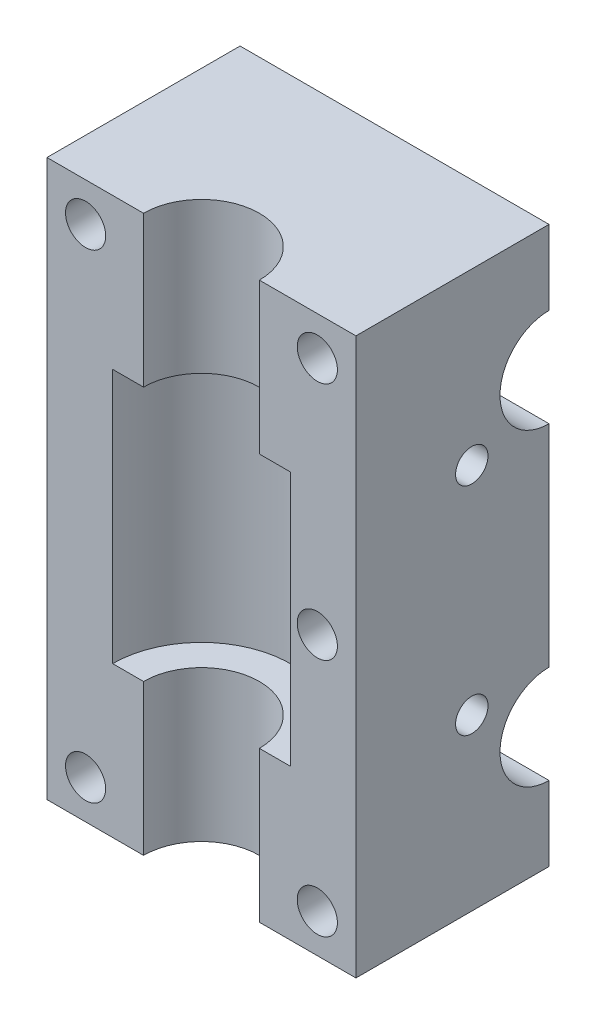
ISO-10303-21;
HEADER;
FILE_DESCRIPTION(('STEP AP214'),'2;1');
FILE_NAME('part.step','',(''),(''),'','','');
FILE_SCHEMA(('AUTOMOTIVE_DESIGN { 1 0 10303 214 1 1 1 1 }'));
ENDSEC;
DATA;
#1=APPLICATION_CONTEXT('core data for automotive mechanical design processes');
#2=APPLICATION_PROTOCOL_DEFINITION('international standard','automotive_design',2000,#1);
#3=PRODUCT_CONTEXT('',#1,'mechanical');
#4=PRODUCT('Part','Part','',(#3));
#5=PRODUCT_RELATED_PRODUCT_CATEGORY('part','',(#4));
#6=PRODUCT_DEFINITION_FORMATION('','',#4);
#7=PRODUCT_DEFINITION_CONTEXT('part definition',#1,'design');
#8=PRODUCT_DEFINITION('design','',#6,#7);
#9=PRODUCT_DEFINITION_SHAPE('','',#8);
#10=(LENGTH_UNIT() NAMED_UNIT(*) SI_UNIT(.MILLI.,.METRE.));
#11=(NAMED_UNIT(*) PLANE_ANGLE_UNIT() SI_UNIT($,.RADIAN.));
#12=(NAMED_UNIT(*) SI_UNIT($,.STERADIAN.) SOLID_ANGLE_UNIT());
#13=UNCERTAINTY_MEASURE_WITH_UNIT(LENGTH_MEASURE(1.E-05),#10,'distance_accuracy_value','');
#14=(GEOMETRIC_REPRESENTATION_CONTEXT(3) GLOBAL_UNCERTAINTY_ASSIGNED_CONTEXT((#13)) GLOBAL_UNIT_ASSIGNED_CONTEXT((#10,
#11,#12)) REPRESENTATION_CONTEXT('',''));
#15=CARTESIAN_POINT('',(0.,0.,0.));
#16=DIRECTION('',(0.,0.,1.));
#17=DIRECTION('',(1.,0.,0.));
#18=AXIS2_PLACEMENT_3D('',#15,#16,#17);
#19=CARTESIAN_POINT('',(0.,36.,0.));
#20=DIRECTION('',(0.,0.,-1.));
#21=DIRECTION('',(-1.,0.,0.));
#22=AXIS2_PLACEMENT_3D('',#19,#20,#21);
#23=PLANE('',#22);
#24=CARTESIAN_POINT('',(5.,-31.,0.));
#25=DIRECTION('',(0.,0.,1.));
#26=DIRECTION('',(1.,0.,0.));
#27=AXIS2_PLACEMENT_3D('',#24,#25,#26);
#28=CIRCLE('',#27,2.6);
#29=CARTESIAN_POINT('',(7.6,-31.,0.));
#30=VERTEX_POINT('',#29);
#31=EDGE_CURVE('E319',#30,#30,#28,.T.);
#32=ORIENTED_EDGE('',*,*,#31,.F.);
#33=EDGE_LOOP('',(#32));
#34=FACE_BOUND('',#33,.T.);
#35=CARTESIAN_POINT('',(5.,31.,0.));
#36=DIRECTION('',(0.,0.,1.));
#37=DIRECTION('',(1.,0.,0.));
#38=AXIS2_PLACEMENT_3D('',#35,#36,#37);
#39=CIRCLE('',#38,2.6);
#40=CARTESIAN_POINT('',(7.6,31.,0.));
#41=VERTEX_POINT('',#40);
#42=EDGE_CURVE('E295',#41,#41,#39,.T.);
#43=ORIENTED_EDGE('',*,*,#42,.F.);
#44=EDGE_LOOP('',(#43));
#45=FACE_BOUND('',#44,.T.);
#46=DIRECTION('',(1.,0.,0.));
#47=VECTOR('',#46,1.);
#48=CARTESIAN_POINT('',(8.5,-16.5,0.));
#49=LINE('',#48,#47);
#50=CARTESIAN_POINT('',(8.5,-16.5,0.));
#51=VERTEX_POINT('',#50);
#52=CARTESIAN_POINT('',(12.5,-16.5,0.));
#53=VERTEX_POINT('',#52);
#54=EDGE_CURVE('E166',#51,#53,#49,.T.);
#55=ORIENTED_EDGE('',*,*,#54,.F.);
#56=DIRECTION('',(0.,1.,0.));
#57=VECTOR('',#56,1.);
#58=CARTESIAN_POINT('',(8.5,-16.5,0.));
#59=LINE('',#58,#57);
#60=CARTESIAN_POINT('',(8.5,16.5,0.));
#61=VERTEX_POINT('',#60);
#62=EDGE_CURVE('E169',#51,#61,#59,.T.);
#63=ORIENTED_EDGE('',*,*,#62,.T.);
#64=DIRECTION('',(1.,0.,0.));
#65=VECTOR('',#64,1.);
#66=CARTESIAN_POINT('',(8.5,16.5,0.));
#67=LINE('',#66,#65);
#68=CARTESIAN_POINT('',(12.5,16.5,0.));
#69=VERTEX_POINT('',#68);
#70=EDGE_CURVE('E167',#61,#69,#67,.T.);
#71=ORIENTED_EDGE('',*,*,#70,.T.);
#72=DIRECTION('',(0.,-1.,0.));
#73=VECTOR('',#72,1.);
#74=CARTESIAN_POINT('',(12.5,36.,0.));
#75=LINE('',#74,#73);
#76=CARTESIAN_POINT('',(12.5,36.,0.));
#77=VERTEX_POINT('',#76);
#78=EDGE_CURVE('E227',#77,#69,#75,.T.);
#79=ORIENTED_EDGE('',*,*,#78,.F.);
#80=DIRECTION('',(1.,0.,0.));
#81=VECTOR('',#80,1.);
#82=CARTESIAN_POINT('',(0.,36.,0.));
#83=LINE('',#82,#81);
#84=CARTESIAN_POINT('',(0.,36.,0.));
#85=VERTEX_POINT('',#84);
#86=EDGE_CURVE('E187',#85,#77,#83,.T.);
#87=ORIENTED_EDGE('',*,*,#86,.F.);
#88=DIRECTION('',(0.,-1.,0.));
#89=VECTOR('',#88,1.);
#90=CARTESIAN_POINT('',(0.,36.,0.));
#91=LINE('',#90,#89);
#92=CARTESIAN_POINT('',(0.,-36.,0.));
#93=VERTEX_POINT('',#92);
#94=EDGE_CURVE('E230',#85,#93,#91,.T.);
#95=ORIENTED_EDGE('',*,*,#94,.T.);
#96=DIRECTION('',(1.,0.,0.));
#97=VECTOR('',#96,1.);
#98=CARTESIAN_POINT('',(0.,-36.,0.));
#99=LINE('',#98,#97);
#100=CARTESIAN_POINT('',(12.5,-36.,0.));
#101=VERTEX_POINT('',#100);
#102=EDGE_CURVE('E201',#93,#101,#99,.T.);
#103=ORIENTED_EDGE('',*,*,#102,.T.);
#104=EDGE_CURVE('E226',#53,#101,#75,.T.);
#105=ORIENTED_EDGE('',*,*,#104,.F.);
#106=EDGE_LOOP('',(#55,#63,#71,#79,#87,#95,#103,#105));
#107=FACE_BOUND('',#106,.T.);
#108=ADVANCED_FACE('F33',(#34,#45,#107),#23,.F.);
#109=CARTESIAN_POINT('',(20.,36.,0.));
#110=DIRECTION('',(0.,-1.,0.));
#111=DIRECTION('',(0.,0.,-1.));
#112=AXIS2_PLACEMENT_3D('',#109,#110,#111);
#113=CYLINDRICAL_SURFACE('',#112,7.5);
#114=CARTESIAN_POINT('',(20.,-16.5,0.));
#115=DIRECTION('',(0.,1.,0.));
#116=DIRECTION('',(0.,0.,1.));
#117=AXIS2_PLACEMENT_3D('',#114,#115,#116);
#118=CIRCLE('',#117,7.5);
#119=CARTESIAN_POINT('',(27.5,-16.5,0.));
#120=VERTEX_POINT('',#119);
#121=EDGE_CURVE('E181',#53,#120,#118,.F.);
#122=ORIENTED_EDGE('',*,*,#121,.F.);
#123=ORIENTED_EDGE('',*,*,#104,.T.);
#124=CARTESIAN_POINT('',(20.,-36.,0.));
#125=DIRECTION('',(0.,-1.,0.));
#126=DIRECTION('',(0.,0.,1.));
#127=AXIS2_PLACEMENT_3D('',#124,#125,#126);
#128=CIRCLE('',#127,7.5);
#129=CARTESIAN_POINT('',(27.5,-36.,0.));
#130=VERTEX_POINT('',#129);
#131=EDGE_CURVE('E204',#101,#130,#128,.T.);
#132=ORIENTED_EDGE('',*,*,#131,.T.);
#133=DIRECTION('',(0.,-1.,0.));
#134=VECTOR('',#133,1.);
#135=CARTESIAN_POINT('',(27.5,36.,0.));
#136=LINE('',#135,#134);
#137=EDGE_CURVE('E222',#120,#130,#136,.T.);
#138=ORIENTED_EDGE('',*,*,#137,.F.);
#139=EDGE_LOOP('',(#122,#123,#132,#138));
#140=FACE_BOUND('',#139,.T.);
#141=ADVANCED_FACE('F257',(#140),#113,.F.);
#142=CARTESIAN_POINT('',(27.5,36.,0.));
#143=DIRECTION('',(0.,0.,-1.));
#144=DIRECTION('',(-1.,0.,0.));
#145=AXIS2_PLACEMENT_3D('',#142,#143,#144);
#146=PLANE('',#145);
#147=CARTESIAN_POINT('',(35.,0.,0.));
#148=DIRECTION('',(0.,0.,1.));
#149=DIRECTION('',(1.,0.,0.));
#150=AXIS2_PLACEMENT_3D('',#147,#148,#149);
#151=CIRCLE('',#150,2.6);
#152=CARTESIAN_POINT('',(37.6,0.,0.));
#153=VERTEX_POINT('',#152);
#154=EDGE_CURVE('E313',#153,#153,#151,.T.);
#155=ORIENTED_EDGE('',*,*,#154,.F.);
#156=EDGE_LOOP('',(#155));
#157=FACE_BOUND('',#156,.T.);
#158=CARTESIAN_POINT('',(35.,-31.,0.));
#159=DIRECTION('',(0.,0.,1.));
#160=DIRECTION('',(1.,0.,0.));
#161=AXIS2_PLACEMENT_3D('',#158,#159,#160);
#162=CIRCLE('',#161,2.6);
#163=CARTESIAN_POINT('',(37.6,-31.,0.));
#164=VERTEX_POINT('',#163);
#165=EDGE_CURVE('E301',#164,#164,#162,.T.);
#166=ORIENTED_EDGE('',*,*,#165,.F.);
#167=EDGE_LOOP('',(#166));
#168=FACE_BOUND('',#167,.T.);
#169=CARTESIAN_POINT('',(35.,31.,0.));
#170=DIRECTION('',(0.,0.,1.));
#171=DIRECTION('',(1.,0.,0.));
#172=AXIS2_PLACEMENT_3D('',#169,#170,#171);
#173=CIRCLE('',#172,2.6);
#174=CARTESIAN_POINT('',(37.6,31.,0.));
#175=VERTEX_POINT('',#174);
#176=EDGE_CURVE('E308',#175,#175,#173,.T.);
#177=ORIENTED_EDGE('',*,*,#176,.F.);
#178=EDGE_LOOP('',(#177));
#179=FACE_BOUND('',#178,.T.);
#180=DIRECTION('',(1.,0.,0.));
#181=VECTOR('',#180,1.);
#182=CARTESIAN_POINT('',(27.5,-16.5,0.));
#183=LINE('',#182,#181);
#184=CARTESIAN_POINT('',(31.5,-16.5,0.));
#185=VERTEX_POINT('',#184);
#186=EDGE_CURVE('E11',#120,#185,#183,.T.);
#187=ORIENTED_EDGE('',*,*,#186,.F.);
#188=ORIENTED_EDGE('',*,*,#137,.T.);
#189=DIRECTION('',(1.,0.,0.));
#190=VECTOR('',#189,1.);
#191=CARTESIAN_POINT('',(27.5,-36.,0.));
#192=LINE('',#191,#190);
#193=CARTESIAN_POINT('',(40.,-36.,0.));
#194=VERTEX_POINT('',#193);
#195=EDGE_CURVE('E207',#130,#194,#192,.T.);
#196=ORIENTED_EDGE('',*,*,#195,.T.);
#197=DIRECTION('',(0.,-1.,0.));
#198=VECTOR('',#197,1.);
#199=CARTESIAN_POINT('',(40.,36.,0.));
#200=LINE('',#199,#198);
#201=CARTESIAN_POINT('',(40.,36.,0.));
#202=VERTEX_POINT('',#201);
#203=EDGE_CURVE('E219',#202,#194,#200,.T.);
#204=ORIENTED_EDGE('',*,*,#203,.F.);
#205=DIRECTION('',(1.,0.,0.));
#206=VECTOR('',#205,1.);
#207=CARTESIAN_POINT('',(27.5,36.,0.));
#208=LINE('',#207,#206);
#209=CARTESIAN_POINT('',(27.5,36.,0.));
#210=VERTEX_POINT('',#209);
#211=EDGE_CURVE('E192',#210,#202,#208,.T.);
#212=ORIENTED_EDGE('',*,*,#211,.F.);
#213=CARTESIAN_POINT('',(27.5,16.5,0.));
#214=VERTEX_POINT('',#213);
#215=EDGE_CURVE('E223',#210,#214,#136,.T.);
#216=ORIENTED_EDGE('',*,*,#215,.T.);
#217=DIRECTION('',(1.,0.,0.));
#218=VECTOR('',#217,1.);
#219=CARTESIAN_POINT('',(27.5,16.5,0.));
#220=LINE('',#219,#218);
#221=CARTESIAN_POINT('',(31.5,16.5,0.));
#222=VERTEX_POINT('',#221);
#223=EDGE_CURVE('E41',#214,#222,#220,.T.);
#224=ORIENTED_EDGE('',*,*,#223,.T.);
#225=DIRECTION('',(0.,1.,0.));
#226=VECTOR('',#225,1.);
#227=CARTESIAN_POINT('',(31.5,-16.5,0.));
#228=LINE('',#227,#226);
#229=EDGE_CURVE('E173',#185,#222,#228,.T.);
#230=ORIENTED_EDGE('',*,*,#229,.F.);
#231=EDGE_LOOP('',(#187,#188,#196,#204,#212,#216,#224,#230));
#232=FACE_BOUND('',#231,.T.);
#233=ADVANCED_FACE('F236',(#157,#168,#179,#232),#146,.F.);
#234=CARTESIAN_POINT('',(0.,36.,0.));
#235=DIRECTION('',(1.,0.,0.));
#236=DIRECTION('',(0.,0.,-1.));
#237=AXIS2_PLACEMENT_3D('',#234,#235,#236);
#238=PLANE('',#237);
#239=CARTESIAN_POINT('',(0.,-14.,-15.));
#240=DIRECTION('',(1.,0.,0.));
#241=DIRECTION('',(0.,0.,-1.));
#242=AXIS2_PLACEMENT_3D('',#239,#240,#241);
#243=CIRCLE('',#242,2.1);
#244=CARTESIAN_POINT('',(0.,-14.,-17.1));
#245=VERTEX_POINT('',#244);
#246=EDGE_CURVE('E286',#245,#245,#243,.T.);
#247=ORIENTED_EDGE('',*,*,#246,.T.);
#248=EDGE_LOOP('',(#247));
#249=FACE_BOUND('',#248,.T.);
#250=CARTESIAN_POINT('',(0.,14.,-15.));
#251=DIRECTION('',(1.,0.,0.));
#252=DIRECTION('',(0.,0.,-1.));
#253=AXIS2_PLACEMENT_3D('',#250,#251,#252);
#254=CIRCLE('',#253,2.1);
#255=CARTESIAN_POINT('',(0.,14.,-17.1));
#256=VERTEX_POINT('',#255);
#257=EDGE_CURVE('E279',#256,#256,#254,.T.);
#258=ORIENTED_EDGE('',*,*,#257,.T.);
#259=EDGE_LOOP('',(#258));
#260=FACE_BOUND('',#259,.T.);
#261=DIRECTION('',(0.,0.,1.));
#262=VECTOR('',#261,1.);
#263=CARTESIAN_POINT('',(0.,-36.,0.));
#264=LINE('',#263,#262);
#265=CARTESIAN_POINT('',(0.,-36.,-25.));
#266=VERTEX_POINT('',#265);
#267=EDGE_CURVE('E183',#266,#93,#264,.T.);
#268=ORIENTED_EDGE('',*,*,#267,.T.);
#269=ORIENTED_EDGE('',*,*,#94,.F.);
#270=DIRECTION('',(0.,0.,1.));
#271=VECTOR('',#270,1.);
#272=CARTESIAN_POINT('',(0.,36.,0.));
#273=LINE('',#272,#271);
#274=CARTESIAN_POINT('',(0.,36.,-25.));
#275=VERTEX_POINT('',#274);
#276=EDGE_CURVE('E184',#275,#85,#273,.T.);
#277=ORIENTED_EDGE('',*,*,#276,.F.);
#278=DIRECTION('',(0.,-1.,0.));
#279=VECTOR('',#278,1.);
#280=CARTESIAN_POINT('',(0.,36.,-25.));
#281=LINE('',#280,#279);
#282=EDGE_CURVE('E198',#275,#266,#281,.T.);
#283=ORIENTED_EDGE('',*,*,#282,.T.);
#284=EDGE_LOOP('',(#268,#269,#277,#283));
#285=FACE_BOUND('',#284,.T.);
#286=ADVANCED_FACE('F35',(#249,#260,#285),#238,.F.);
#287=ORIENTED_EDGE('',*,*,#78,.T.);
#288=CARTESIAN_POINT('',(20.,16.5,0.));
#289=DIRECTION('',(0.,1.,0.));
#290=DIRECTION('',(0.,0.,1.));
#291=AXIS2_PLACEMENT_3D('',#288,#289,#290);
#292=CIRCLE('',#291,7.5);
#293=EDGE_CURVE('E176',#69,#214,#292,.F.);
#294=ORIENTED_EDGE('',*,*,#293,.T.);
#295=ORIENTED_EDGE('',*,*,#215,.F.);
#296=CARTESIAN_POINT('',(20.,36.,0.));
#297=DIRECTION('',(0.,-1.,0.));
#298=DIRECTION('',(0.,0.,1.));
#299=AXIS2_PLACEMENT_3D('',#296,#297,#298);
#300=CIRCLE('',#299,7.5);
#301=EDGE_CURVE('E190',#77,#210,#300,.T.);
#302=ORIENTED_EDGE('',*,*,#301,.F.);
#303=EDGE_LOOP('',(#287,#294,#295,#302));
#304=FACE_BOUND('',#303,.T.);
#305=ADVANCED_FACE('F243',(#304),#113,.F.);
#306=CARTESIAN_POINT('',(40.,36.,0.));
#307=DIRECTION('',(-1.,0.,0.));
#308=DIRECTION('',(0.,0.,1.));
#309=AXIS2_PLACEMENT_3D('',#306,#307,#308);
#310=PLANE('',#309);
#311=CARTESIAN_POINT('',(40.,-14.,-15.));
#312=DIRECTION('',(1.,0.,0.));
#313=DIRECTION('',(0.,0.,-1.));
#314=AXIS2_PLACEMENT_3D('',#311,#312,#313);
#315=CIRCLE('',#314,2.1);
#316=CARTESIAN_POINT('',(40.,-14.,-17.1));
#317=VERTEX_POINT('',#316);
#318=EDGE_CURVE('E289',#317,#317,#315,.T.);
#319=ORIENTED_EDGE('',*,*,#318,.F.);
#320=EDGE_LOOP('',(#319));
#321=FACE_BOUND('',#320,.T.);
#322=CARTESIAN_POINT('',(40.,14.,-15.));
#323=DIRECTION('',(1.,0.,0.));
#324=DIRECTION('',(0.,0.,-1.));
#325=AXIS2_PLACEMENT_3D('',#322,#323,#324);
#326=CIRCLE('',#325,2.1);
#327=CARTESIAN_POINT('',(40.,14.,-17.1));
#328=VERTEX_POINT('',#327);
#329=EDGE_CURVE('E281',#328,#328,#326,.T.);
#330=ORIENTED_EDGE('',*,*,#329,.F.);
#331=EDGE_LOOP('',(#330));
#332=FACE_BOUND('',#331,.T.);
#333=DIRECTION('',(0.,-1.,0.));
#334=VECTOR('',#333,1.);
#335=CARTESIAN_POINT('',(40.,36.,-25.));
#336=LINE('',#335,#334);
#337=CARTESIAN_POINT('',(40.,-26.35,-25.));
#338=VERTEX_POINT('',#337);
#339=CARTESIAN_POINT('',(40.,-36.,-25.));
#340=VERTEX_POINT('',#339);
#341=EDGE_CURVE('E215',#338,#340,#336,.T.);
#342=ORIENTED_EDGE('',*,*,#341,.F.);
#343=CARTESIAN_POINT('',(40.,-20.,-25.));
#344=DIRECTION('',(1.,0.,0.));
#345=DIRECTION('',(0.,0.,-1.));
#346=AXIS2_PLACEMENT_3D('',#343,#344,#345);
#347=CIRCLE('',#346,6.35);
#348=CARTESIAN_POINT('',(40.,-13.65,-25.));
#349=VERTEX_POINT('',#348);
#350=EDGE_CURVE('E139',#349,#338,#347,.T.);
#351=ORIENTED_EDGE('',*,*,#350,.F.);
#352=CARTESIAN_POINT('',(40.,13.65,-25.));
#353=VERTEX_POINT('',#352);
#354=EDGE_CURVE('E148',#353,#349,#336,.T.);
#355=ORIENTED_EDGE('',*,*,#354,.F.);
#356=CARTESIAN_POINT('',(40.,20.,-25.));
#357=DIRECTION('',(1.,0.,0.));
#358=DIRECTION('',(0.,0.,-1.));
#359=AXIS2_PLACEMENT_3D('',#356,#357,#358);
#360=CIRCLE('',#359,6.35);
#361=CARTESIAN_POINT('',(40.,26.35,-25.));
#362=VERTEX_POINT('',#361);
#363=EDGE_CURVE('E149',#362,#353,#360,.T.);
#364=ORIENTED_EDGE('',*,*,#363,.F.);
#365=CARTESIAN_POINT('',(40.,36.,-25.));
#366=VERTEX_POINT('',#365);
#367=EDGE_CURVE('E216',#366,#362,#336,.T.);
#368=ORIENTED_EDGE('',*,*,#367,.F.);
#369=DIRECTION('',(0.,0.,-1.));
#370=VECTOR('',#369,1.);
#371=CARTESIAN_POINT('',(40.,36.,0.));
#372=LINE('',#371,#370);
#373=EDGE_CURVE('E194',#202,#366,#372,.T.);
#374=ORIENTED_EDGE('',*,*,#373,.F.);
#375=ORIENTED_EDGE('',*,*,#203,.T.);
#376=DIRECTION('',(0.,0.,-1.));
#377=VECTOR('',#376,1.);
#378=CARTESIAN_POINT('',(40.,-36.,0.));
#379=LINE('',#378,#377);
#380=EDGE_CURVE('E209',#194,#340,#379,.T.);
#381=ORIENTED_EDGE('',*,*,#380,.T.);
#382=EDGE_LOOP('',(#342,#351,#355,#364,#368,#374,#375,#381));
#383=FACE_BOUND('',#382,.T.);
#384=ADVANCED_FACE('F269',(#321,#332,#383),#310,.F.);
#385=CARTESIAN_POINT('',(0.,36.,-25.));
#386=DIRECTION('',(0.,0.,1.));
#387=DIRECTION('',(1.,0.,0.));
#388=AXIS2_PLACEMENT_3D('',#385,#386,#387);
#389=PLANE('',#388);
#390=CARTESIAN_POINT('',(35.,0.,-25.));
#391=DIRECTION('',(0.,0.,1.));
#392=DIRECTION('',(1.,0.,0.));
#393=AXIS2_PLACEMENT_3D('',#390,#391,#392);
#394=CIRCLE('',#393,2.6);
#395=CARTESIAN_POINT('',(37.6,0.,-25.));
#396=VERTEX_POINT('',#395);
#397=EDGE_CURVE('E316',#396,#396,#394,.T.);
#398=ORIENTED_EDGE('',*,*,#397,.T.);
#399=EDGE_LOOP('',(#398));
#400=FACE_BOUND('',#399,.T.);
#401=CARTESIAN_POINT('',(5.,-31.,-25.));
#402=DIRECTION('',(0.,0.,1.));
#403=DIRECTION('',(1.,0.,0.));
#404=AXIS2_PLACEMENT_3D('',#401,#402,#403);
#405=CIRCLE('',#404,2.6);
#406=CARTESIAN_POINT('',(7.6,-31.,-25.));
#407=VERTEX_POINT('',#406);
#408=EDGE_CURVE('E305',#407,#407,#405,.T.);
#409=ORIENTED_EDGE('',*,*,#408,.T.);
#410=EDGE_LOOP('',(#409));
#411=FACE_BOUND('',#410,.T.);
#412=CARTESIAN_POINT('',(35.,-31.,-25.));
#413=DIRECTION('',(0.,0.,1.));
#414=DIRECTION('',(1.,0.,0.));
#415=AXIS2_PLACEMENT_3D('',#412,#413,#414);
#416=CIRCLE('',#415,2.6);
#417=CARTESIAN_POINT('',(37.6,-31.,-25.));
#418=VERTEX_POINT('',#417);
#419=EDGE_CURVE('E304',#418,#418,#416,.T.);
#420=ORIENTED_EDGE('',*,*,#419,.T.);
#421=EDGE_LOOP('',(#420));
#422=FACE_BOUND('',#421,.T.);
#423=CARTESIAN_POINT('',(35.,31.,-25.));
#424=DIRECTION('',(0.,0.,1.));
#425=DIRECTION('',(1.,0.,0.));
#426=AXIS2_PLACEMENT_3D('',#423,#424,#425);
#427=CIRCLE('',#426,2.6);
#428=CARTESIAN_POINT('',(37.6,31.,-25.));
#429=VERTEX_POINT('',#428);
#430=EDGE_CURVE('E298',#429,#429,#427,.T.);
#431=ORIENTED_EDGE('',*,*,#430,.T.);
#432=EDGE_LOOP('',(#431));
#433=FACE_BOUND('',#432,.T.);
#434=CARTESIAN_POINT('',(5.,31.,-25.));
#435=DIRECTION('',(0.,0.,1.));
#436=DIRECTION('',(1.,0.,0.));
#437=AXIS2_PLACEMENT_3D('',#434,#435,#436);
#438=CIRCLE('',#437,2.6);
#439=CARTESIAN_POINT('',(7.6,31.,-25.));
#440=VERTEX_POINT('',#439);
#441=EDGE_CURVE('E292',#440,#440,#438,.T.);
#442=ORIENTED_EDGE('',*,*,#441,.T.);
#443=EDGE_LOOP('',(#442));
#444=FACE_BOUND('',#443,.T.);
#445=DIRECTION('',(0.,1.,0.));
#446=VECTOR('',#445,1.);
#447=CARTESIAN_POINT('',(30.,-13.65,-25.));
#448=LINE('',#447,#446);
#449=CARTESIAN_POINT('',(30.,-26.35,-25.));
#450=VERTEX_POINT('',#449);
#451=CARTESIAN_POINT('',(30.,-13.65,-25.));
#452=VERTEX_POINT('',#451);
#453=EDGE_CURVE('E138',#450,#452,#448,.T.);
#454=ORIENTED_EDGE('',*,*,#453,.F.);
#455=DIRECTION('',(1.,0.,0.));
#456=VECTOR('',#455,1.);
#457=CARTESIAN_POINT('',(30.,-26.35,-25.));
#458=LINE('',#457,#456);
#459=EDGE_CURVE('E136',#450,#338,#458,.T.);
#460=ORIENTED_EDGE('',*,*,#459,.T.);
#461=ORIENTED_EDGE('',*,*,#341,.T.);
#462=DIRECTION('',(-1.,0.,0.));
#463=VECTOR('',#462,1.);
#464=CARTESIAN_POINT('',(0.,-36.,-25.));
#465=LINE('',#464,#463);
#466=EDGE_CURVE('E188',#340,#266,#465,.T.);
#467=ORIENTED_EDGE('',*,*,#466,.T.);
#468=ORIENTED_EDGE('',*,*,#282,.F.);
#469=DIRECTION('',(-1.,0.,0.));
#470=VECTOR('',#469,1.);
#471=CARTESIAN_POINT('',(0.,36.,-25.));
#472=LINE('',#471,#470);
#473=EDGE_CURVE('E196',#366,#275,#472,.T.);
#474=ORIENTED_EDGE('',*,*,#473,.F.);
#475=ORIENTED_EDGE('',*,*,#367,.T.);
#476=DIRECTION('',(1.,0.,0.));
#477=VECTOR('',#476,1.);
#478=CARTESIAN_POINT('',(30.,26.35,-25.));
#479=LINE('',#478,#477);
#480=CARTESIAN_POINT('',(30.,26.35,-25.));
#481=VERTEX_POINT('',#480);
#482=EDGE_CURVE('E159',#481,#362,#479,.T.);
#483=ORIENTED_EDGE('',*,*,#482,.F.);
#484=DIRECTION('',(0.,1.,0.));
#485=VECTOR('',#484,1.);
#486=CARTESIAN_POINT('',(30.,26.35,-25.));
#487=LINE('',#486,#485);
#488=CARTESIAN_POINT('',(30.,13.65,-25.));
#489=VERTEX_POINT('',#488);
#490=EDGE_CURVE('E156',#489,#481,#487,.T.);
#491=ORIENTED_EDGE('',*,*,#490,.F.);
#492=DIRECTION('',(1.,0.,0.));
#493=VECTOR('',#492,1.);
#494=CARTESIAN_POINT('',(30.,13.65,-25.));
#495=LINE('',#494,#493);
#496=EDGE_CURVE('E157',#489,#353,#495,.T.);
#497=ORIENTED_EDGE('',*,*,#496,.T.);
#498=ORIENTED_EDGE('',*,*,#354,.T.);
#499=DIRECTION('',(1.,0.,0.));
#500=VECTOR('',#499,1.);
#501=CARTESIAN_POINT('',(30.,-13.65,-25.));
#502=LINE('',#501,#500);
#503=EDGE_CURVE('E133',#452,#349,#502,.T.);
#504=ORIENTED_EDGE('',*,*,#503,.F.);
#505=EDGE_LOOP('',(#454,#460,#461,#467,#468,#474,#475,#483,#491,#497,#498,#504));
#506=FACE_BOUND('',#505,.T.);
#507=ADVANCED_FACE('F145',(#400,#411,#422,#433,#444,#506),#389,.F.);
#508=CARTESIAN_POINT('',(20.,36.,0.));
#509=DIRECTION('',(0.,1.,0.));
#510=DIRECTION('',(0.,0.,1.));
#511=AXIS2_PLACEMENT_3D('',#508,#509,#510);
#512=PLANE('',#511);
#513=ORIENTED_EDGE('',*,*,#276,.T.);
#514=ORIENTED_EDGE('',*,*,#86,.T.);
#515=ORIENTED_EDGE('',*,*,#301,.T.);
#516=ORIENTED_EDGE('',*,*,#211,.T.);
#517=ORIENTED_EDGE('',*,*,#373,.T.);
#518=ORIENTED_EDGE('',*,*,#473,.T.);
#519=EDGE_LOOP('',(#513,#514,#515,#516,#517,#518));
#520=FACE_BOUND('',#519,.T.);
#521=ADVANCED_FACE('F274',(#520),#512,.T.);
#522=CARTESIAN_POINT('',(20.,-36.,0.));
#523=DIRECTION('',(0.,1.,0.));
#524=DIRECTION('',(0.,0.,1.));
#525=AXIS2_PLACEMENT_3D('',#522,#523,#524);
#526=PLANE('',#525);
#527=ORIENTED_EDGE('',*,*,#267,.F.);
#528=ORIENTED_EDGE('',*,*,#466,.F.);
#529=ORIENTED_EDGE('',*,*,#380,.F.);
#530=ORIENTED_EDGE('',*,*,#195,.F.);
#531=ORIENTED_EDGE('',*,*,#131,.F.);
#532=ORIENTED_EDGE('',*,*,#102,.F.);
#533=EDGE_LOOP('',(#527,#528,#529,#530,#531,#532));
#534=FACE_BOUND('',#533,.T.);
#535=ADVANCED_FACE('F263',(#534),#526,.F.);
#536=CARTESIAN_POINT('',(20.,-16.5,0.));
#537=DIRECTION('',(0.,1.,0.));
#538=DIRECTION('',(0.,0.,1.));
#539=AXIS2_PLACEMENT_3D('',#536,#537,#538);
#540=PLANE('',#539);
#541=ORIENTED_EDGE('',*,*,#121,.T.);
#542=ORIENTED_EDGE('',*,*,#186,.T.);
#543=CARTESIAN_POINT('',(20.,-16.5,0.));
#544=DIRECTION('',(0.,1.,0.));
#545=DIRECTION('',(0.,0.,1.));
#546=AXIS2_PLACEMENT_3D('',#543,#544,#545);
#547=CIRCLE('',#546,11.5);
#548=EDGE_CURVE('E163',#185,#51,#547,.T.);
#549=ORIENTED_EDGE('',*,*,#548,.T.);
#550=ORIENTED_EDGE('',*,*,#54,.T.);
#551=EDGE_LOOP('',(#541,#542,#549,#550));
#552=FACE_BOUND('',#551,.T.);
#553=ADVANCED_FACE('F253',(#552),#540,.T.);
#554=CARTESIAN_POINT('',(20.,16.5,0.));
#555=DIRECTION('',(0.,1.,0.));
#556=DIRECTION('',(0.,0.,1.));
#557=AXIS2_PLACEMENT_3D('',#554,#555,#556);
#558=PLANE('',#557);
#559=ORIENTED_EDGE('',*,*,#70,.F.);
#560=CARTESIAN_POINT('',(20.,16.5,0.));
#561=DIRECTION('',(0.,1.,0.));
#562=DIRECTION('',(0.,0.,1.));
#563=AXIS2_PLACEMENT_3D('',#560,#561,#562);
#564=CIRCLE('',#563,11.5);
#565=EDGE_CURVE('E161',#222,#61,#564,.T.);
#566=ORIENTED_EDGE('',*,*,#565,.F.);
#567=ORIENTED_EDGE('',*,*,#223,.F.);
#568=ORIENTED_EDGE('',*,*,#293,.F.);
#569=EDGE_LOOP('',(#559,#566,#567,#568));
#570=FACE_BOUND('',#569,.T.);
#571=ADVANCED_FACE('F241',(#570),#558,.F.);
#572=CARTESIAN_POINT('',(20.,-16.5,0.));
#573=DIRECTION('',(0.,1.,0.));
#574=DIRECTION('',(0.,0.,1.));
#575=AXIS2_PLACEMENT_3D('',#572,#573,#574);
#576=CYLINDRICAL_SURFACE('',#575,11.5);
#577=ORIENTED_EDGE('',*,*,#565,.T.);
#578=ORIENTED_EDGE('',*,*,#62,.F.);
#579=ORIENTED_EDGE('',*,*,#548,.F.);
#580=ORIENTED_EDGE('',*,*,#229,.T.);
#581=EDGE_LOOP('',(#577,#578,#579,#580));
#582=FACE_BOUND('',#581,.T.);
#583=ADVANCED_FACE('F251',(#582),#576,.F.);
#584=CARTESIAN_POINT('',(30.,20.,-25.));
#585=DIRECTION('',(1.,0.,0.));
#586=DIRECTION('',(0.,0.,-1.));
#587=AXIS2_PLACEMENT_3D('',#584,#585,#586);
#588=CYLINDRICAL_SURFACE('',#587,6.35);
#589=ORIENTED_EDGE('',*,*,#363,.T.);
#590=ORIENTED_EDGE('',*,*,#496,.F.);
#591=CARTESIAN_POINT('',(30.,20.,-25.));
#592=DIRECTION('',(1.,0.,0.));
#593=DIRECTION('',(0.,0.,-1.));
#594=AXIS2_PLACEMENT_3D('',#591,#592,#593);
#595=CIRCLE('',#594,6.35);
#596=EDGE_CURVE('E54',#481,#489,#595,.T.);
#597=ORIENTED_EDGE('',*,*,#596,.F.);
#598=ORIENTED_EDGE('',*,*,#482,.T.);
#599=EDGE_LOOP('',(#589,#590,#597,#598));
#600=FACE_BOUND('',#599,.T.);
#601=ADVANCED_FACE('F367',(#600),#588,.F.);
#602=CARTESIAN_POINT('',(30.,20.,-25.));
#603=DIRECTION('',(1.,0.,0.));
#604=DIRECTION('',(0.,0.,-1.));
#605=AXIS2_PLACEMENT_3D('',#602,#603,#604);
#606=PLANE('',#605);
#607=ORIENTED_EDGE('',*,*,#596,.T.);
#608=ORIENTED_EDGE('',*,*,#490,.T.);
#609=EDGE_LOOP('',(#607,#608));
#610=FACE_BOUND('',#609,.T.);
#611=ADVANCED_FACE('F364',(#610),#606,.T.);
#612=CARTESIAN_POINT('',(30.,-20.,-25.));
#613=DIRECTION('',(1.,0.,0.));
#614=DIRECTION('',(0.,0.,-1.));
#615=AXIS2_PLACEMENT_3D('',#612,#613,#614);
#616=CYLINDRICAL_SURFACE('',#615,6.35);
#617=ORIENTED_EDGE('',*,*,#350,.T.);
#618=ORIENTED_EDGE('',*,*,#459,.F.);
#619=CARTESIAN_POINT('',(30.,-20.,-25.));
#620=DIRECTION('',(1.,0.,0.));
#621=DIRECTION('',(0.,0.,-1.));
#622=AXIS2_PLACEMENT_3D('',#619,#620,#621);
#623=CIRCLE('',#622,6.35);
#624=EDGE_CURVE('E47',#452,#450,#623,.T.);
#625=ORIENTED_EDGE('',*,*,#624,.F.);
#626=ORIENTED_EDGE('',*,*,#503,.T.);
#627=EDGE_LOOP('',(#617,#618,#625,#626));
#628=FACE_BOUND('',#627,.T.);
#629=ADVANCED_FACE('F131',(#628),#616,.F.);
#630=CARTESIAN_POINT('',(30.,-20.,-25.));
#631=DIRECTION('',(1.,0.,0.));
#632=DIRECTION('',(0.,0.,-1.));
#633=AXIS2_PLACEMENT_3D('',#630,#631,#632);
#634=PLANE('',#633);
#635=ORIENTED_EDGE('',*,*,#624,.T.);
#636=ORIENTED_EDGE('',*,*,#453,.T.);
#637=EDGE_LOOP('',(#635,#636));
#638=FACE_BOUND('',#637,.T.);
#639=ADVANCED_FACE('F141',(#638),#634,.T.);
#640=CARTESIAN_POINT('',(0.,14.,-15.));
#641=DIRECTION('',(1.,0.,0.));
#642=DIRECTION('',(0.,0.,-1.));
#643=AXIS2_PLACEMENT_3D('',#640,#641,#642);
#644=CYLINDRICAL_SURFACE('',#643,2.1);
#645=ORIENTED_EDGE('',*,*,#257,.F.);
#646=EDGE_LOOP('',(#645));
#647=FACE_BOUND('',#646,.T.);
#648=ORIENTED_EDGE('',*,*,#329,.T.);
#649=EDGE_LOOP('',(#648));
#650=FACE_BOUND('',#649,.T.);
#651=ADVANCED_FACE('F351',(#647,#650),#644,.F.);
#652=CARTESIAN_POINT('',(0.,-14.,-15.));
#653=DIRECTION('',(1.,0.,0.));
#654=DIRECTION('',(0.,0.,-1.));
#655=AXIS2_PLACEMENT_3D('',#652,#653,#654);
#656=CYLINDRICAL_SURFACE('',#655,2.1);
#657=ORIENTED_EDGE('',*,*,#246,.F.);
#658=EDGE_LOOP('',(#657));
#659=FACE_BOUND('',#658,.T.);
#660=ORIENTED_EDGE('',*,*,#318,.T.);
#661=EDGE_LOOP('',(#660));
#662=FACE_BOUND('',#661,.T.);
#663=ADVANCED_FACE('F342',(#659,#662),#656,.F.);
#664=CARTESIAN_POINT('',(5.,31.,-25.));
#665=DIRECTION('',(0.,0.,1.));
#666=DIRECTION('',(1.,0.,0.));
#667=AXIS2_PLACEMENT_3D('',#664,#665,#666);
#668=CYLINDRICAL_SURFACE('',#667,2.6);
#669=ORIENTED_EDGE('',*,*,#441,.F.);
#670=EDGE_LOOP('',(#669));
#671=FACE_BOUND('',#670,.T.);
#672=ORIENTED_EDGE('',*,*,#42,.T.);
#673=EDGE_LOOP('',(#672));
#674=FACE_BOUND('',#673,.T.);
#675=ADVANCED_FACE('F339',(#671,#674),#668,.F.);
#676=CARTESIAN_POINT('',(35.,31.,-25.));
#677=DIRECTION('',(0.,0.,1.));
#678=DIRECTION('',(1.,0.,0.));
#679=AXIS2_PLACEMENT_3D('',#676,#677,#678);
#680=CYLINDRICAL_SURFACE('',#679,2.6);
#681=ORIENTED_EDGE('',*,*,#430,.F.);
#682=EDGE_LOOP('',(#681));
#683=FACE_BOUND('',#682,.T.);
#684=ORIENTED_EDGE('',*,*,#176,.T.);
#685=EDGE_LOOP('',(#684));
#686=FACE_BOUND('',#685,.T.);
#687=ADVANCED_FACE('F341',(#683,#686),#680,.F.);
#688=CARTESIAN_POINT('',(35.,-31.,-25.));
#689=DIRECTION('',(0.,0.,1.));
#690=DIRECTION('',(1.,0.,0.));
#691=AXIS2_PLACEMENT_3D('',#688,#689,#690);
#692=CYLINDRICAL_SURFACE('',#691,2.6);
#693=ORIENTED_EDGE('',*,*,#419,.F.);
#694=EDGE_LOOP('',(#693));
#695=FACE_BOUND('',#694,.T.);
#696=ORIENTED_EDGE('',*,*,#165,.T.);
#697=EDGE_LOOP('',(#696));
#698=FACE_BOUND('',#697,.T.);
#699=ADVANCED_FACE('F331',(#695,#698),#692,.F.);
#700=CARTESIAN_POINT('',(5.,-31.,-25.));
#701=DIRECTION('',(0.,0.,1.));
#702=DIRECTION('',(1.,0.,0.));
#703=AXIS2_PLACEMENT_3D('',#700,#701,#702);
#704=CYLINDRICAL_SURFACE('',#703,2.6);
#705=ORIENTED_EDGE('',*,*,#408,.F.);
#706=EDGE_LOOP('',(#705));
#707=FACE_BOUND('',#706,.T.);
#708=ORIENTED_EDGE('',*,*,#31,.T.);
#709=EDGE_LOOP('',(#708));
#710=FACE_BOUND('',#709,.T.);
#711=ADVANCED_FACE('F327',(#707,#710),#704,.F.);
#712=CARTESIAN_POINT('',(35.,0.,-25.));
#713=DIRECTION('',(0.,0.,1.));
#714=DIRECTION('',(1.,0.,0.));
#715=AXIS2_PLACEMENT_3D('',#712,#713,#714);
#716=CYLINDRICAL_SURFACE('',#715,2.6);
#717=ORIENTED_EDGE('',*,*,#397,.F.);
#718=EDGE_LOOP('',(#717));
#719=FACE_BOUND('',#718,.T.);
#720=ORIENTED_EDGE('',*,*,#154,.T.);
#721=EDGE_LOOP('',(#720));
#722=FACE_BOUND('',#721,.T.);
#723=ADVANCED_FACE('F330',(#719,#722),#716,.F.);
#724=CLOSED_SHELL('',(#108,#141,#233,#286,#305,#384,#507,#521,#535,#553,#571,#583,#601,#611,
#629,#639,#651,#663,#675,#687,#699,#711,#723));
#725=MANIFOLD_SOLID_BREP('B2',#724);
#726=ADVANCED_BREP_SHAPE_REPRESENTATION('',(#18,#725),#14);
#727=SHAPE_DEFINITION_REPRESENTATION(#9,#726);
ENDSEC;
END-ISO-10303-21;
